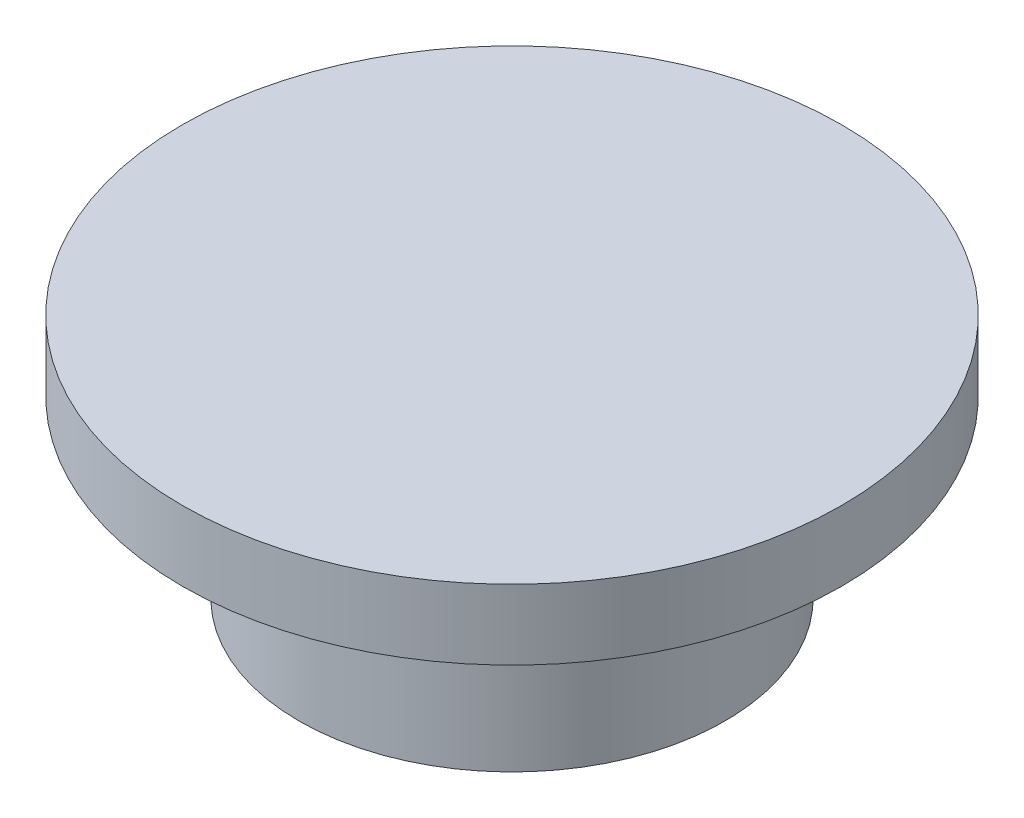
ISO-10303-21;
HEADER;
FILE_DESCRIPTION(('STEP AP214'),'2;1');
FILE_NAME('part.step','',(''),(''),'','','');
FILE_SCHEMA(('AUTOMOTIVE_DESIGN { 1 0 10303 214 1 1 1 1 }'));
ENDSEC;
DATA;
#1=APPLICATION_CONTEXT('core data for automotive mechanical design processes');
#2=APPLICATION_PROTOCOL_DEFINITION('international standard','automotive_design',2000,#1);
#3=PRODUCT_CONTEXT('',#1,'mechanical');
#4=PRODUCT('Part','Part','',(#3));
#5=PRODUCT_RELATED_PRODUCT_CATEGORY('part','',(#4));
#6=PRODUCT_DEFINITION_FORMATION('','',#4);
#7=PRODUCT_DEFINITION_CONTEXT('part definition',#1,'design');
#8=PRODUCT_DEFINITION('design','',#6,#7);
#9=PRODUCT_DEFINITION_SHAPE('','',#8);
#10=(LENGTH_UNIT() NAMED_UNIT(*) SI_UNIT(.MILLI.,.METRE.));
#11=(NAMED_UNIT(*) PLANE_ANGLE_UNIT() SI_UNIT($,.RADIAN.));
#12=(NAMED_UNIT(*) SI_UNIT($,.STERADIAN.) SOLID_ANGLE_UNIT());
#13=UNCERTAINTY_MEASURE_WITH_UNIT(LENGTH_MEASURE(1.E-05),#10,'distance_accuracy_value','');
#14=(GEOMETRIC_REPRESENTATION_CONTEXT(3) GLOBAL_UNCERTAINTY_ASSIGNED_CONTEXT((#13)) GLOBAL_UNIT_ASSIGNED_CONTEXT((#10,
#11,#12)) REPRESENTATION_CONTEXT('',''));
#15=CARTESIAN_POINT('',(0.,0.,0.));
#16=DIRECTION('',(0.,0.,1.));
#17=DIRECTION('',(1.,0.,0.));
#18=AXIS2_PLACEMENT_3D('',#15,#16,#17);
#19=CARTESIAN_POINT('',(0.,0.,0.));
#20=DIRECTION('',(0.,-1.,0.));
#21=DIRECTION('',(0.,0.,-1.));
#22=AXIS2_PLACEMENT_3D('',#19,#20,#21);
#23=CYLINDRICAL_SURFACE('',#22,5.3);
#24=CARTESIAN_POINT('',(0.,0.,0.));
#25=DIRECTION('',(0.,-1.,0.));
#26=DIRECTION('',(0.,0.,-1.));
#27=AXIS2_PLACEMENT_3D('',#24,#25,#26);
#28=CIRCLE('',#27,5.3);
#29=CARTESIAN_POINT('',(0.,0.,-5.3));
#30=VERTEX_POINT('',#29);
#31=EDGE_CURVE('E10',#30,#30,#28,.T.);
#32=ORIENTED_EDGE('',*,*,#31,.T.);
#33=EDGE_LOOP('',(#32));
#34=FACE_BOUND('',#33,.T.);
#35=CARTESIAN_POINT('',(0.,8.,0.));
#36=DIRECTION('',(0.,1.,0.));
#37=DIRECTION('',(0.,0.,1.));
#38=AXIS2_PLACEMENT_3D('',#35,#36,#37);
#39=CIRCLE('',#38,5.3);
#40=CARTESIAN_POINT('',(0.,8.,5.3));
#41=VERTEX_POINT('',#40);
#42=EDGE_CURVE('E35',#41,#41,#39,.T.);
#43=ORIENTED_EDGE('',*,*,#42,.T.);
#44=EDGE_LOOP('',(#43));
#45=FACE_BOUND('',#44,.T.);
#46=ADVANCED_FACE('F31',(#34,#45),#23,.F.);
#47=CARTESIAN_POINT('',(7.3,0.,0.));
#48=DIRECTION('',(0.,-1.,0.));
#49=DIRECTION('',(0.,0.,-1.));
#50=AXIS2_PLACEMENT_3D('',#47,#48,#49);
#51=PLANE('',#50);
#52=CARTESIAN_POINT('',(0.,0.,0.));
#53=DIRECTION('',(0.,-1.,0.));
#54=DIRECTION('',(0.,0.,-1.));
#55=AXIS2_PLACEMENT_3D('',#52,#53,#54);
#56=CIRCLE('',#55,7.3);
#57=CARTESIAN_POINT('',(0.,0.,-7.3));
#58=VERTEX_POINT('',#57);
#59=EDGE_CURVE('E51',#58,#58,#56,.T.);
#60=ORIENTED_EDGE('',*,*,#59,.T.);
#61=EDGE_LOOP('',(#60));
#62=FACE_BOUND('',#61,.T.);
#63=ORIENTED_EDGE('',*,*,#31,.F.);
#64=EDGE_LOOP('',(#63));
#65=FACE_BOUND('',#64,.T.);
#66=ADVANCED_FACE('F33',(#62,#65),#51,.T.);
#67=CARTESIAN_POINT('',(5.3,8.4,0.));
#68=DIRECTION('',(0.,1.,0.));
#69=DIRECTION('',(0.,0.,1.));
#70=AXIS2_PLACEMENT_3D('',#67,#68,#69);
#71=PLANE('',#70);
#72=CARTESIAN_POINT('',(0.,8.4,0.));
#73=DIRECTION('',(0.,-1.,0.));
#74=DIRECTION('',(0.,0.,-1.));
#75=AXIS2_PLACEMENT_3D('',#72,#73,#74);
#76=CIRCLE('',#75,11.3);
#77=CARTESIAN_POINT('',(0.,8.4,-11.3));
#78=VERTEX_POINT('',#77);
#79=EDGE_CURVE('E39',#78,#78,#76,.T.);
#80=ORIENTED_EDGE('',*,*,#79,.F.);
#81=EDGE_LOOP('',(#80));
#82=FACE_BOUND('',#81,.T.);
#83=ADVANCED_FACE('F73',(#82),#71,.T.);
#84=CARTESIAN_POINT('',(0.,0.,0.));
#85=DIRECTION('',(0.,-1.,0.));
#86=DIRECTION('',(0.,0.,-1.));
#87=AXIS2_PLACEMENT_3D('',#84,#85,#86);
#88=CYLINDRICAL_SURFACE('',#87,11.3);
#89=ORIENTED_EDGE('',*,*,#79,.T.);
#90=EDGE_LOOP('',(#89));
#91=FACE_BOUND('',#90,.T.);
#92=CARTESIAN_POINT('',(0.,6.,0.));
#93=DIRECTION('',(0.,-1.,0.));
#94=DIRECTION('',(0.,0.,-1.));
#95=AXIS2_PLACEMENT_3D('',#92,#93,#94);
#96=CIRCLE('',#95,11.3);
#97=CARTESIAN_POINT('',(0.,6.,-11.3));
#98=VERTEX_POINT('',#97);
#99=EDGE_CURVE('E43',#98,#98,#96,.T.);
#100=ORIENTED_EDGE('',*,*,#99,.F.);
#101=EDGE_LOOP('',(#100));
#102=FACE_BOUND('',#101,.T.);
#103=ADVANCED_FACE('F77',(#91,#102),#88,.T.);
#104=CARTESIAN_POINT('',(11.3,6.,0.));
#105=DIRECTION('',(0.,-1.,0.));
#106=DIRECTION('',(0.,0.,-1.));
#107=AXIS2_PLACEMENT_3D('',#104,#105,#106);
#108=PLANE('',#107);
#109=ORIENTED_EDGE('',*,*,#99,.T.);
#110=EDGE_LOOP('',(#109));
#111=FACE_BOUND('',#110,.T.);
#112=CARTESIAN_POINT('',(0.,6.,0.));
#113=DIRECTION('',(0.,-1.,0.));
#114=DIRECTION('',(0.,0.,-1.));
#115=AXIS2_PLACEMENT_3D('',#112,#113,#114);
#116=CIRCLE('',#115,7.3);
#117=CARTESIAN_POINT('',(0.,6.,-7.3));
#118=VERTEX_POINT('',#117);
#119=EDGE_CURVE('E48',#118,#118,#116,.T.);
#120=ORIENTED_EDGE('',*,*,#119,.F.);
#121=EDGE_LOOP('',(#120));
#122=FACE_BOUND('',#121,.T.);
#123=ADVANCED_FACE('F66',(#111,#122),#108,.T.);
#124=CARTESIAN_POINT('',(0.,0.,0.));
#125=DIRECTION('',(0.,-1.,0.));
#126=DIRECTION('',(0.,0.,-1.));
#127=AXIS2_PLACEMENT_3D('',#124,#125,#126);
#128=CYLINDRICAL_SURFACE('',#127,7.3);
#129=ORIENTED_EDGE('',*,*,#119,.T.);
#130=EDGE_LOOP('',(#129));
#131=FACE_BOUND('',#130,.T.);
#132=ORIENTED_EDGE('',*,*,#59,.F.);
#133=EDGE_LOOP('',(#132));
#134=FACE_BOUND('',#133,.T.);
#135=ADVANCED_FACE('F61',(#131,#134),#128,.T.);
#136=CARTESIAN_POINT('',(0.,8.,0.));
#137=DIRECTION('',(0.,1.,0.));
#138=DIRECTION('',(0.,0.,1.));
#139=AXIS2_PLACEMENT_3D('',#136,#137,#138);
#140=PLANE('',#139);
#141=ORIENTED_EDGE('',*,*,#42,.F.);
#142=EDGE_LOOP('',(#141));
#143=FACE_BOUND('',#142,.T.);
#144=ADVANCED_FACE('F59',(#143),#140,.F.);
#145=CLOSED_SHELL('',(#46,#66,#83,#103,#123,#135,#144));
#146=MANIFOLD_SOLID_BREP('B2',#145);
#147=ADVANCED_BREP_SHAPE_REPRESENTATION('',(#18,#146),#14);
#148=SHAPE_DEFINITION_REPRESENTATION(#9,#147);
ENDSEC;
END-ISO-10303-21;
